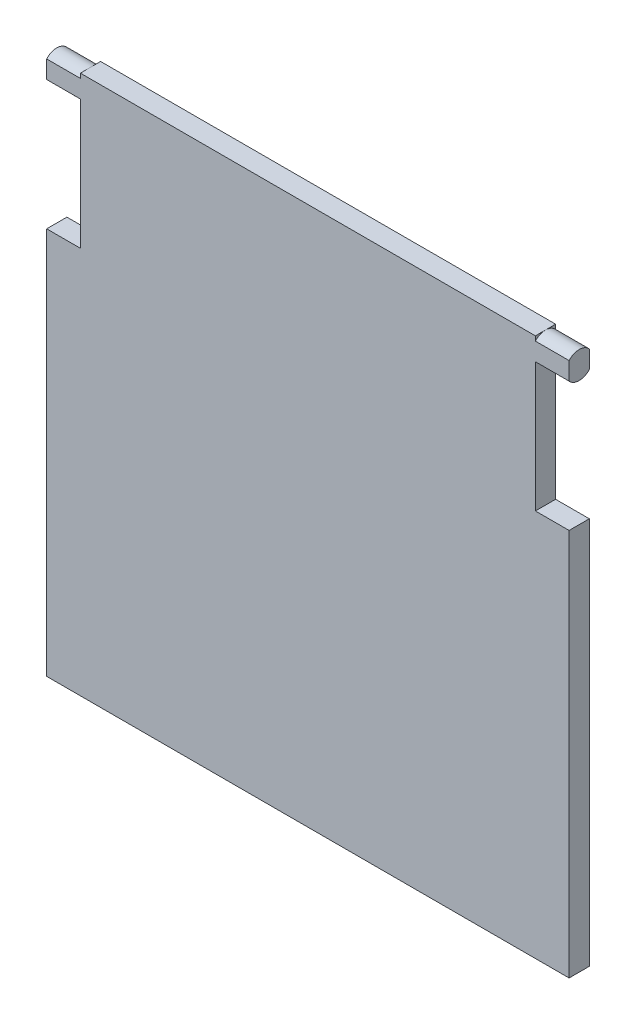
ISO-10303-21;
HEADER;
FILE_DESCRIPTION(('STEP AP214'),'2;1');
FILE_NAME('part.step','',(''),(''),'','','');
FILE_SCHEMA(('AUTOMOTIVE_DESIGN { 1 0 10303 214 1 1 1 1 }'));
ENDSEC;
DATA;
#1=APPLICATION_CONTEXT('core data for automotive mechanical design processes');
#2=APPLICATION_PROTOCOL_DEFINITION('international standard','automotive_design',2000,#1);
#3=PRODUCT_CONTEXT('',#1,'mechanical');
#4=PRODUCT('Part','Part','',(#3));
#5=PRODUCT_RELATED_PRODUCT_CATEGORY('part','',(#4));
#6=PRODUCT_DEFINITION_FORMATION('','',#4);
#7=PRODUCT_DEFINITION_CONTEXT('part definition',#1,'design');
#8=PRODUCT_DEFINITION('design','',#6,#7);
#9=PRODUCT_DEFINITION_SHAPE('','',#8);
#10=(LENGTH_UNIT() NAMED_UNIT(*) SI_UNIT(.MILLI.,.METRE.));
#11=(NAMED_UNIT(*) PLANE_ANGLE_UNIT() SI_UNIT($,.RADIAN.));
#12=(NAMED_UNIT(*) SI_UNIT($,.STERADIAN.) SOLID_ANGLE_UNIT());
#13=UNCERTAINTY_MEASURE_WITH_UNIT(LENGTH_MEASURE(1.E-05),#10,'distance_accuracy_value','');
#14=(GEOMETRIC_REPRESENTATION_CONTEXT(3) GLOBAL_UNCERTAINTY_ASSIGNED_CONTEXT((#13)) GLOBAL_UNIT_ASSIGNED_CONTEXT((#10,
#11,#12)) REPRESENTATION_CONTEXT('',''));
#15=CARTESIAN_POINT('',(0.,0.,0.));
#16=DIRECTION('',(0.,0.,1.));
#17=DIRECTION('',(1.,0.,0.));
#18=AXIS2_PLACEMENT_3D('',#15,#16,#17);
#19=CARTESIAN_POINT('',(1.99999999999999,2.,1.2));
#20=DIRECTION('',(1.,0.,0.));
#21=DIRECTION('',(0.,1.,0.));
#22=AXIS2_PLACEMENT_3D('',#19,#20,#21);
#23=PLANE('',#22);
#24=DIRECTION('',(0.,0.,-1.));
#25=VECTOR('',#24,1.);
#26=CARTESIAN_POINT('',(1.99999999999999,2.,1.2));
#27=LINE('',#26,#25);
#28=CARTESIAN_POINT('',(1.99999999999999,2.,1.2));
#29=VERTEX_POINT('',#28);
#30=CARTESIAN_POINT('',(1.99999999999999,2.,0.6));
#31=VERTEX_POINT('',#30);
#32=EDGE_CURVE('E311',#29,#31,#27,.T.);
#33=ORIENTED_EDGE('',*,*,#32,.T.);
#34=CARTESIAN_POINT('',(2.,1.2,0.6));
#35=DIRECTION('',(1.,0.,0.));
#36=DIRECTION('',(0.,1.,0.));
#37=AXIS2_PLACEMENT_3D('',#34,#35,#36);
#38=CIRCLE('',#37,0.800000000000001);
#39=CARTESIAN_POINT('',(1.99999999999999,1.72915026221292,1.2));
#40=VERTEX_POINT('',#39);
#41=EDGE_CURVE('E359',#31,#40,#38,.T.);
#42=ORIENTED_EDGE('',*,*,#41,.T.);
#43=DIRECTION('',(0.,-1.,0.));
#44=VECTOR('',#43,1.);
#45=CARTESIAN_POINT('',(1.99999999999999,2.,1.2));
#46=LINE('',#45,#44);
#47=EDGE_CURVE('E169',#29,#40,#46,.T.);
#48=ORIENTED_EDGE('',*,*,#47,.F.);
#49=EDGE_LOOP('',(#33,#42,#48));
#50=FACE_BOUND('',#49,.T.);
#51=ADVANCED_FACE('F40',(#50),#23,.F.);
#52=DIRECTION('',(0.,-1.,0.));
#53=VECTOR('',#52,1.);
#54=CARTESIAN_POINT('',(1.99999999999999,2.,0.));
#55=LINE('',#54,#53);
#56=CARTESIAN_POINT('',(1.99999999999999,2.,0.));
#57=VERTEX_POINT('',#56);
#58=CARTESIAN_POINT('',(1.99999999999999,1.72915026221292,0.));
#59=VERTEX_POINT('',#58);
#60=EDGE_CURVE('E284',#57,#59,#55,.T.);
#61=ORIENTED_EDGE('',*,*,#60,.T.);
#62=EDGE_CURVE('E56',#59,#31,#38,.T.);
#63=ORIENTED_EDGE('',*,*,#62,.T.);
#64=EDGE_CURVE('E310',#31,#57,#27,.T.);
#65=ORIENTED_EDGE('',*,*,#64,.T.);
#66=EDGE_LOOP('',(#61,#63,#65));
#67=FACE_BOUND('',#66,.T.);
#68=ADVANCED_FACE('F371',(#67),#23,.F.);
#69=CARTESIAN_POINT('',(29.,2.00000000000001,1.2));
#70=DIRECTION('',(-1.,0.,0.));
#71=DIRECTION('',(0.,-1.,0.));
#72=AXIS2_PLACEMENT_3D('',#69,#70,#71);
#73=PLANE('',#72);
#74=CARTESIAN_POINT('',(29.,1.2,0.6));
#75=DIRECTION('',(1.,0.,0.));
#76=DIRECTION('',(0.,1.,0.));
#77=AXIS2_PLACEMENT_3D('',#74,#75,#76);
#78=CIRCLE('',#77,0.800000000000001);
#79=CARTESIAN_POINT('',(29.,0.670849737787085,1.2));
#80=VERTEX_POINT('',#79);
#81=CARTESIAN_POINT('',(29.,0.670849737787085,0.));
#82=VERTEX_POINT('',#81);
#83=EDGE_CURVE('E174',#80,#82,#78,.T.);
#84=ORIENTED_EDGE('',*,*,#83,.F.);
#85=DIRECTION('',(0.,1.,0.));
#86=VECTOR('',#85,1.);
#87=CARTESIAN_POINT('',(29.,2.00000000000001,1.2));
#88=LINE('',#87,#86);
#89=CARTESIAN_POINT('',(29.,-6.99999999999999,1.2));
#90=VERTEX_POINT('',#89);
#91=EDGE_CURVE('E250',#90,#80,#88,.T.);
#92=ORIENTED_EDGE('',*,*,#91,.F.);
#93=DIRECTION('',(0.,0.,-1.));
#94=VECTOR('',#93,1.);
#95=CARTESIAN_POINT('',(29.,-6.99999999999999,1.2));
#96=LINE('',#95,#94);
#97=CARTESIAN_POINT('',(29.,-6.99999999999999,0.));
#98=VERTEX_POINT('',#97);
#99=EDGE_CURVE('E49',#90,#98,#96,.T.);
#100=ORIENTED_EDGE('',*,*,#99,.T.);
#101=DIRECTION('',(0.,1.,0.));
#102=VECTOR('',#101,1.);
#103=CARTESIAN_POINT('',(29.,2.00000000000001,0.));
#104=LINE('',#103,#102);
#105=EDGE_CURVE('E276',#98,#82,#104,.T.);
#106=ORIENTED_EDGE('',*,*,#105,.T.);
#107=EDGE_LOOP('',(#84,#92,#100,#106));
#108=FACE_BOUND('',#107,.T.);
#109=ADVANCED_FACE('F325',(#108),#73,.F.);
#110=CARTESIAN_POINT('',(29.,1.72915026221292,0.));
#111=VERTEX_POINT('',#110);
#112=CARTESIAN_POINT('',(29.,2.00000000000001,0.6));
#113=VERTEX_POINT('',#112);
#114=EDGE_CURVE('E214',#111,#113,#78,.T.);
#115=ORIENTED_EDGE('',*,*,#114,.F.);
#116=CARTESIAN_POINT('',(29.,2.00000000000001,0.));
#117=VERTEX_POINT('',#116);
#118=EDGE_CURVE('E275',#111,#117,#104,.T.);
#119=ORIENTED_EDGE('',*,*,#118,.T.);
#120=DIRECTION('',(0.,0.,-1.));
#121=VECTOR('',#120,1.);
#122=CARTESIAN_POINT('',(29.,2.00000000000001,1.2));
#123=LINE('',#122,#121);
#124=EDGE_CURVE('E315',#113,#117,#123,.T.);
#125=ORIENTED_EDGE('',*,*,#124,.F.);
#126=EDGE_LOOP('',(#115,#119,#125));
#127=FACE_BOUND('',#126,.T.);
#128=ADVANCED_FACE('F392',(#127),#73,.F.);
#129=CARTESIAN_POINT('',(31.,-6.99999999999999,1.2));
#130=DIRECTION('',(-1.,0.,0.));
#131=DIRECTION('',(0.,-1.,0.));
#132=AXIS2_PLACEMENT_3D('',#129,#130,#131);
#133=PLANE('',#132);
#134=DIRECTION('',(0.,1.,0.));
#135=VECTOR('',#134,1.);
#136=CARTESIAN_POINT('',(31.,-6.99999999999999,0.));
#137=LINE('',#136,#135);
#138=CARTESIAN_POINT('',(31.,-30.,0.));
#139=VERTEX_POINT('',#138);
#140=CARTESIAN_POINT('',(31.,-6.99999999999999,0.));
#141=VERTEX_POINT('',#140);
#142=EDGE_CURVE('E241',#139,#141,#137,.T.);
#143=ORIENTED_EDGE('',*,*,#142,.T.);
#144=DIRECTION('',(0.,0.,-1.));
#145=VECTOR('',#144,1.);
#146=CARTESIAN_POINT('',(31.,-6.99999999999999,1.2));
#147=LINE('',#146,#145);
#148=CARTESIAN_POINT('',(31.,-6.99999999999999,1.2));
#149=VERTEX_POINT('',#148);
#150=EDGE_CURVE('E12',#149,#141,#147,.T.);
#151=ORIENTED_EDGE('',*,*,#150,.F.);
#152=DIRECTION('',(0.,1.,0.));
#153=VECTOR('',#152,1.);
#154=CARTESIAN_POINT('',(31.,-6.99999999999999,1.2));
#155=LINE('',#154,#153);
#156=CARTESIAN_POINT('',(31.,-30.,1.2));
#157=VERTEX_POINT('',#156);
#158=EDGE_CURVE('E242',#157,#149,#155,.T.);
#159=ORIENTED_EDGE('',*,*,#158,.F.);
#160=DIRECTION('',(0.,0.,-1.));
#161=VECTOR('',#160,1.);
#162=CARTESIAN_POINT('',(31.,-30.,1.2));
#163=LINE('',#162,#161);
#164=EDGE_CURVE('E268',#157,#139,#163,.T.);
#165=ORIENTED_EDGE('',*,*,#164,.T.);
#166=EDGE_LOOP('',(#143,#151,#159,#165));
#167=FACE_BOUND('',#166,.T.);
#168=ADVANCED_FACE('F42',(#167),#133,.F.);
#169=CARTESIAN_POINT('',(31.,-6.99999999999999,1.2));
#170=DIRECTION('',(0.,-1.,0.));
#171=DIRECTION('',(1.,0.,0.));
#172=AXIS2_PLACEMENT_3D('',#169,#170,#171);
#173=PLANE('',#172);
#174=DIRECTION('',(-1.,0.,0.));
#175=VECTOR('',#174,1.);
#176=CARTESIAN_POINT('',(31.,-6.99999999999999,0.));
#177=LINE('',#176,#175);
#178=EDGE_CURVE('E272',#141,#98,#177,.T.);
#179=ORIENTED_EDGE('',*,*,#178,.T.);
#180=ORIENTED_EDGE('',*,*,#99,.F.);
#181=DIRECTION('',(-1.,0.,0.));
#182=VECTOR('',#181,1.);
#183=CARTESIAN_POINT('',(31.,-6.99999999999999,1.2));
#184=LINE('',#183,#182);
#185=EDGE_CURVE('E245',#149,#90,#184,.T.);
#186=ORIENTED_EDGE('',*,*,#185,.F.);
#187=ORIENTED_EDGE('',*,*,#150,.T.);
#188=EDGE_LOOP('',(#179,#180,#186,#187));
#189=FACE_BOUND('',#188,.T.);
#190=ADVANCED_FACE('F339',(#189),#173,.F.);
#191=CARTESIAN_POINT('',(29.,1.72915026221292,1.2));
#192=VERTEX_POINT('',#191);
#193=EDGE_CURVE('E224',#113,#192,#78,.T.);
#194=ORIENTED_EDGE('',*,*,#193,.F.);
#195=CARTESIAN_POINT('',(29.,2.00000000000001,1.2));
#196=VERTEX_POINT('',#195);
#197=EDGE_CURVE('E316',#196,#113,#123,.T.);
#198=ORIENTED_EDGE('',*,*,#197,.F.);
#199=EDGE_CURVE('E249',#192,#196,#88,.T.);
#200=ORIENTED_EDGE('',*,*,#199,.F.);
#201=EDGE_LOOP('',(#194,#198,#200));
#202=FACE_BOUND('',#201,.T.);
#203=ADVANCED_FACE('F385',(#202),#73,.F.);
#204=CARTESIAN_POINT('',(1.99999999999999,2.,1.2));
#205=DIRECTION('',(0.,-1.,0.));
#206=DIRECTION('',(1.,0.,0.));
#207=AXIS2_PLACEMENT_3D('',#204,#205,#206);
#208=PLANE('',#207);
#209=DIRECTION('',(-1.,0.,0.));
#210=VECTOR('',#209,1.);
#211=CARTESIAN_POINT('',(1.99999999999999,2.,0.));
#212=LINE('',#211,#210);
#213=EDGE_CURVE('E279',#117,#57,#212,.T.);
#214=ORIENTED_EDGE('',*,*,#213,.T.);
#215=ORIENTED_EDGE('',*,*,#64,.F.);
#216=ORIENTED_EDGE('',*,*,#32,.F.);
#217=DIRECTION('',(-1.,0.,0.));
#218=VECTOR('',#217,1.);
#219=CARTESIAN_POINT('',(1.99999999999999,2.,1.2));
#220=LINE('',#219,#218);
#221=EDGE_CURVE('E254',#196,#29,#220,.T.);
#222=ORIENTED_EDGE('',*,*,#221,.F.);
#223=ORIENTED_EDGE('',*,*,#197,.T.);
#224=ORIENTED_EDGE('',*,*,#124,.T.);
#225=EDGE_LOOP('',(#214,#215,#216,#222,#223,#224));
#226=FACE_BOUND('',#225,.T.);
#227=ADVANCED_FACE('F380',(#226),#208,.F.);
#228=CARTESIAN_POINT('',(1.99999999999999,0.670849737787082,1.2));
#229=VERTEX_POINT('',#228);
#230=CARTESIAN_POINT('',(2.,-7.,1.2));
#231=VERTEX_POINT('',#230);
#232=EDGE_CURVE('E64',#229,#231,#46,.T.);
#233=ORIENTED_EDGE('',*,*,#232,.F.);
#234=CARTESIAN_POINT('',(2.,0.670849737787081,0.));
#235=VERTEX_POINT('',#234);
#236=EDGE_CURVE('E186',#229,#235,#38,.T.);
#237=ORIENTED_EDGE('',*,*,#236,.T.);
#238=CARTESIAN_POINT('',(2.,-7.,0.));
#239=VERTEX_POINT('',#238);
#240=EDGE_CURVE('E283',#235,#239,#55,.T.);
#241=ORIENTED_EDGE('',*,*,#240,.T.);
#242=DIRECTION('',(0.,0.,-1.));
#243=VECTOR('',#242,1.);
#244=CARTESIAN_POINT('',(2.,-7.,1.2));
#245=LINE('',#244,#243);
#246=EDGE_CURVE('E306',#231,#239,#245,.T.);
#247=ORIENTED_EDGE('',*,*,#246,.F.);
#248=EDGE_LOOP('',(#233,#237,#241,#247));
#249=FACE_BOUND('',#248,.T.);
#250=ADVANCED_FACE('F357',(#249),#23,.F.);
#251=CARTESIAN_POINT('',(0.,-7.,1.2));
#252=DIRECTION('',(0.,-1.,0.));
#253=DIRECTION('',(0.,0.,-1.));
#254=AXIS2_PLACEMENT_3D('',#251,#252,#253);
#255=PLANE('',#254);
#256=DIRECTION('',(-1.,0.,0.));
#257=VECTOR('',#256,1.);
#258=CARTESIAN_POINT('',(0.,-7.,0.));
#259=LINE('',#258,#257);
#260=CARTESIAN_POINT('',(0.,-7.,0.));
#261=VERTEX_POINT('',#260);
#262=EDGE_CURVE('E287',#239,#261,#259,.T.);
#263=ORIENTED_EDGE('',*,*,#262,.T.);
#264=DIRECTION('',(0.,0.,-1.));
#265=VECTOR('',#264,1.);
#266=CARTESIAN_POINT('',(0.,-7.,1.2));
#267=LINE('',#266,#265);
#268=CARTESIAN_POINT('',(0.,-7.,1.2));
#269=VERTEX_POINT('',#268);
#270=EDGE_CURVE('E302',#269,#261,#267,.T.);
#271=ORIENTED_EDGE('',*,*,#270,.F.);
#272=DIRECTION('',(-1.,0.,0.));
#273=VECTOR('',#272,1.);
#274=CARTESIAN_POINT('',(0.,-7.,1.2));
#275=LINE('',#274,#273);
#276=EDGE_CURVE('E259',#231,#269,#275,.T.);
#277=ORIENTED_EDGE('',*,*,#276,.F.);
#278=ORIENTED_EDGE('',*,*,#246,.T.);
#279=EDGE_LOOP('',(#263,#271,#277,#278));
#280=FACE_BOUND('',#279,.T.);
#281=ADVANCED_FACE('F355',(#280),#255,.F.);
#282=CARTESIAN_POINT('',(0.,-7.,1.2));
#283=DIRECTION('',(1.,0.,0.));
#284=DIRECTION('',(0.,1.,0.));
#285=AXIS2_PLACEMENT_3D('',#282,#283,#284);
#286=PLANE('',#285);
#287=DIRECTION('',(0.,-1.,0.));
#288=VECTOR('',#287,1.);
#289=CARTESIAN_POINT('',(0.,-7.,0.));
#290=LINE('',#289,#288);
#291=CARTESIAN_POINT('',(0.,-30.,0.));
#292=VERTEX_POINT('',#291);
#293=EDGE_CURVE('E290',#261,#292,#290,.T.);
#294=ORIENTED_EDGE('',*,*,#293,.T.);
#295=DIRECTION('',(0.,0.,-1.));
#296=VECTOR('',#295,1.);
#297=CARTESIAN_POINT('',(0.,-30.,1.2));
#298=LINE('',#297,#296);
#299=CARTESIAN_POINT('',(0.,-30.,1.2));
#300=VERTEX_POINT('',#299);
#301=EDGE_CURVE('E298',#300,#292,#298,.T.);
#302=ORIENTED_EDGE('',*,*,#301,.F.);
#303=DIRECTION('',(0.,-1.,0.));
#304=VECTOR('',#303,1.);
#305=CARTESIAN_POINT('',(0.,-7.,1.2));
#306=LINE('',#305,#304);
#307=EDGE_CURVE('E262',#269,#300,#306,.T.);
#308=ORIENTED_EDGE('',*,*,#307,.F.);
#309=ORIENTED_EDGE('',*,*,#270,.T.);
#310=EDGE_LOOP('',(#294,#302,#308,#309));
#311=FACE_BOUND('',#310,.T.);
#312=ADVANCED_FACE('F351',(#311),#286,.F.);
#313=CARTESIAN_POINT('',(0.,-30.,1.2));
#314=DIRECTION('',(0.,1.,0.));
#315=DIRECTION('',(-1.,0.,0.));
#316=AXIS2_PLACEMENT_3D('',#313,#314,#315);
#317=PLANE('',#316);
#318=DIRECTION('',(1.,0.,0.));
#319=VECTOR('',#318,1.);
#320=CARTESIAN_POINT('',(0.,-30.,0.));
#321=LINE('',#320,#319);
#322=EDGE_CURVE('E246',#292,#139,#321,.T.);
#323=ORIENTED_EDGE('',*,*,#322,.T.);
#324=ORIENTED_EDGE('',*,*,#164,.F.);
#325=DIRECTION('',(1.,0.,0.));
#326=VECTOR('',#325,1.);
#327=CARTESIAN_POINT('',(0.,-30.,1.2));
#328=LINE('',#327,#326);
#329=EDGE_CURVE('E265',#300,#157,#328,.T.);
#330=ORIENTED_EDGE('',*,*,#329,.F.);
#331=ORIENTED_EDGE('',*,*,#301,.T.);
#332=EDGE_LOOP('',(#323,#324,#330,#331));
#333=FACE_BOUND('',#332,.T.);
#334=ADVANCED_FACE('F346',(#333),#317,.F.);
#335=CARTESIAN_POINT('',(0.,0.,1.2));
#336=DIRECTION('',(0.,0.,1.));
#337=DIRECTION('',(1.,0.,0.));
#338=AXIS2_PLACEMENT_3D('',#335,#336,#337);
#339=PLANE('',#338);
#340=ORIENTED_EDGE('',*,*,#158,.T.);
#341=ORIENTED_EDGE('',*,*,#185,.T.);
#342=ORIENTED_EDGE('',*,*,#91,.T.);
#343=DIRECTION('',(-1.,0.,0.));
#344=VECTOR('',#343,1.);
#345=CARTESIAN_POINT('',(31.,0.670849737787088,1.2));
#346=LINE('',#345,#344);
#347=CARTESIAN_POINT('',(31.,0.670849737787088,1.2));
#348=VERTEX_POINT('',#347);
#349=EDGE_CURVE('E237',#348,#80,#346,.T.);
#350=ORIENTED_EDGE('',*,*,#349,.F.);
#351=DIRECTION('',(0.,-1.,0.));
#352=VECTOR('',#351,1.);
#353=CARTESIAN_POINT('',(31.,0.,1.2));
#354=LINE('',#353,#352);
#355=CARTESIAN_POINT('',(31.,1.72915026221293,1.2));
#356=VERTEX_POINT('',#355);
#357=EDGE_CURVE('E209',#356,#348,#354,.T.);
#358=ORIENTED_EDGE('',*,*,#357,.F.);
#359=DIRECTION('',(-1.,0.,0.));
#360=VECTOR('',#359,1.);
#361=CARTESIAN_POINT('',(31.,1.72915026221293,1.2));
#362=LINE('',#361,#360);
#363=EDGE_CURVE('E225',#356,#192,#362,.T.);
#364=ORIENTED_EDGE('',*,*,#363,.T.);
#365=ORIENTED_EDGE('',*,*,#199,.T.);
#366=ORIENTED_EDGE('',*,*,#221,.T.);
#367=ORIENTED_EDGE('',*,*,#47,.T.);
#368=DIRECTION('',(1.,0.,0.));
#369=VECTOR('',#368,1.);
#370=CARTESIAN_POINT('',(0.,1.72915026221292,1.2));
#371=LINE('',#370,#369);
#372=CARTESIAN_POINT('',(0.,1.72915026221292,1.2));
#373=VERTEX_POINT('',#372);
#374=EDGE_CURVE('E162',#373,#40,#371,.T.);
#375=ORIENTED_EDGE('',*,*,#374,.F.);
#376=DIRECTION('',(0.,-1.,0.));
#377=VECTOR('',#376,1.);
#378=CARTESIAN_POINT('',(0.,0.,1.2));
#379=LINE('',#378,#377);
#380=CARTESIAN_POINT('',(0.,0.670849737787085,1.2));
#381=VERTEX_POINT('',#380);
#382=EDGE_CURVE('E166',#373,#381,#379,.T.);
#383=ORIENTED_EDGE('',*,*,#382,.T.);
#384=DIRECTION('',(1.,0.,0.));
#385=VECTOR('',#384,1.);
#386=CARTESIAN_POINT('',(0.,0.670849737787085,1.2));
#387=LINE('',#386,#385);
#388=EDGE_CURVE('E196',#381,#229,#387,.T.);
#389=ORIENTED_EDGE('',*,*,#388,.T.);
#390=ORIENTED_EDGE('',*,*,#232,.T.);
#391=ORIENTED_EDGE('',*,*,#276,.T.);
#392=ORIENTED_EDGE('',*,*,#307,.T.);
#393=ORIENTED_EDGE('',*,*,#329,.T.);
#394=EDGE_LOOP('',(#340,#341,#342,#350,#358,#364,#365,#366,#367,#375,#383,#389,#390,#391,#392,#393));
#395=FACE_BOUND('',#394,.T.);
#396=ADVANCED_FACE('F165',(#395),#339,.T.);
#397=CARTESIAN_POINT('',(0.,0.,0.));
#398=DIRECTION('',(0.,0.,1.));
#399=DIRECTION('',(1.,0.,0.));
#400=AXIS2_PLACEMENT_3D('',#397,#398,#399);
#401=PLANE('',#400);
#402=ORIENTED_EDGE('',*,*,#142,.F.);
#403=ORIENTED_EDGE('',*,*,#322,.F.);
#404=ORIENTED_EDGE('',*,*,#293,.F.);
#405=ORIENTED_EDGE('',*,*,#262,.F.);
#406=ORIENTED_EDGE('',*,*,#240,.F.);
#407=DIRECTION('',(1.,0.,0.));
#408=VECTOR('',#407,1.);
#409=CARTESIAN_POINT('',(0.,0.670849737787084,0.));
#410=LINE('',#409,#408);
#411=CARTESIAN_POINT('',(0.,0.670849737787084,0.));
#412=VERTEX_POINT('',#411);
#413=EDGE_CURVE('E200',#412,#235,#410,.T.);
#414=ORIENTED_EDGE('',*,*,#413,.F.);
#415=DIRECTION('',(0.,1.,0.));
#416=VECTOR('',#415,1.);
#417=CARTESIAN_POINT('',(0.,0.,0.));
#418=LINE('',#417,#416);
#419=CARTESIAN_POINT('',(0.,1.72915026221292,0.));
#420=VERTEX_POINT('',#419);
#421=EDGE_CURVE('E191',#412,#420,#418,.T.);
#422=ORIENTED_EDGE('',*,*,#421,.T.);
#423=DIRECTION('',(1.,0.,0.));
#424=VECTOR('',#423,1.);
#425=CARTESIAN_POINT('',(0.,1.72915026221292,0.));
#426=LINE('',#425,#424);
#427=EDGE_CURVE('E175',#420,#59,#426,.T.);
#428=ORIENTED_EDGE('',*,*,#427,.T.);
#429=ORIENTED_EDGE('',*,*,#60,.F.);
#430=ORIENTED_EDGE('',*,*,#213,.F.);
#431=ORIENTED_EDGE('',*,*,#118,.F.);
#432=DIRECTION('',(-1.,0.,0.));
#433=VECTOR('',#432,1.);
#434=CARTESIAN_POINT('',(31.,1.72915026221293,0.));
#435=LINE('',#434,#433);
#436=CARTESIAN_POINT('',(31.,1.72915026221293,0.));
#437=VERTEX_POINT('',#436);
#438=EDGE_CURVE('E229',#437,#111,#435,.T.);
#439=ORIENTED_EDGE('',*,*,#438,.F.);
#440=DIRECTION('',(0.,1.,0.));
#441=VECTOR('',#440,1.);
#442=CARTESIAN_POINT('',(31.,0.,0.));
#443=LINE('',#442,#441);
#444=CARTESIAN_POINT('',(31.,0.670849737787088,0.));
#445=VERTEX_POINT('',#444);
#446=EDGE_CURVE('E217',#445,#437,#443,.T.);
#447=ORIENTED_EDGE('',*,*,#446,.F.);
#448=DIRECTION('',(-1.,0.,0.));
#449=VECTOR('',#448,1.);
#450=CARTESIAN_POINT('',(31.,0.670849737787088,0.));
#451=LINE('',#450,#449);
#452=EDGE_CURVE('E233',#445,#82,#451,.T.);
#453=ORIENTED_EDGE('',*,*,#452,.T.);
#454=ORIENTED_EDGE('',*,*,#105,.F.);
#455=ORIENTED_EDGE('',*,*,#178,.F.);
#456=EDGE_LOOP('',(#402,#403,#404,#405,#406,#414,#422,#428,#429,#430,#431,#439,#447,#453,#454,#455));
#457=FACE_BOUND('',#456,.T.);
#458=ADVANCED_FACE('F329',(#457),#401,.F.);
#459=CARTESIAN_POINT('',(31.,1.20000000000001,0.6));
#460=DIRECTION('',(-1.,0.,0.));
#461=DIRECTION('',(0.,-1.,0.));
#462=AXIS2_PLACEMENT_3D('',#459,#460,#461);
#463=CYLINDRICAL_SURFACE('',#462,0.800000000000001);
#464=ORIENTED_EDGE('',*,*,#83,.T.);
#465=ORIENTED_EDGE('',*,*,#452,.F.);
#466=CARTESIAN_POINT('',(31.,1.20000000000001,0.6));
#467=DIRECTION('',(1.,0.,0.));
#468=DIRECTION('',(0.,1.,0.));
#469=AXIS2_PLACEMENT_3D('',#466,#467,#468);
#470=CIRCLE('',#469,0.800000000000001);
#471=EDGE_CURVE('E213',#348,#445,#470,.T.);
#472=ORIENTED_EDGE('',*,*,#471,.F.);
#473=ORIENTED_EDGE('',*,*,#349,.T.);
#474=EDGE_LOOP('',(#464,#465,#472,#473));
#475=FACE_BOUND('',#474,.T.);
#476=ADVANCED_FACE('F334',(#475),#463,.T.);
#477=ORIENTED_EDGE('',*,*,#114,.T.);
#478=ORIENTED_EDGE('',*,*,#193,.T.);
#479=ORIENTED_EDGE('',*,*,#363,.F.);
#480=EDGE_CURVE('E218',#437,#356,#470,.T.);
#481=ORIENTED_EDGE('',*,*,#480,.F.);
#482=ORIENTED_EDGE('',*,*,#438,.T.);
#483=EDGE_LOOP('',(#477,#478,#479,#481,#482));
#484=FACE_BOUND('',#483,.T.);
#485=ADVANCED_FACE('F413',(#484),#463,.T.);
#486=CARTESIAN_POINT('',(31.,0.,0.));
#487=DIRECTION('',(1.,0.,0.));
#488=DIRECTION('',(0.,1.,0.));
#489=AXIS2_PLACEMENT_3D('',#486,#487,#488);
#490=PLANE('',#489);
#491=ORIENTED_EDGE('',*,*,#357,.T.);
#492=ORIENTED_EDGE('',*,*,#471,.T.);
#493=ORIENTED_EDGE('',*,*,#446,.T.);
#494=ORIENTED_EDGE('',*,*,#480,.T.);
#495=EDGE_LOOP('',(#491,#492,#493,#494));
#496=FACE_BOUND('',#495,.T.);
#497=ADVANCED_FACE('F368',(#496),#490,.T.);
#498=CARTESIAN_POINT('',(0.,1.2,0.6));
#499=DIRECTION('',(1.,0.,0.));
#500=DIRECTION('',(0.,1.,0.));
#501=AXIS2_PLACEMENT_3D('',#498,#499,#500);
#502=CYLINDRICAL_SURFACE('',#501,0.800000000000001);
#503=ORIENTED_EDGE('',*,*,#62,.F.);
#504=ORIENTED_EDGE('',*,*,#427,.F.);
#505=CARTESIAN_POINT('',(0.,1.2,0.6));
#506=DIRECTION('',(1.,0.,0.));
#507=DIRECTION('',(0.,1.,0.));
#508=AXIS2_PLACEMENT_3D('',#505,#506,#507);
#509=CIRCLE('',#508,0.800000000000001);
#510=EDGE_CURVE('E181',#420,#373,#509,.T.);
#511=ORIENTED_EDGE('',*,*,#510,.T.);
#512=ORIENTED_EDGE('',*,*,#374,.T.);
#513=ORIENTED_EDGE('',*,*,#41,.F.);
#514=EDGE_LOOP('',(#503,#504,#511,#512,#513));
#515=FACE_BOUND('',#514,.T.);
#516=ADVANCED_FACE('F188',(#515),#502,.T.);
#517=ORIENTED_EDGE('',*,*,#236,.F.);
#518=ORIENTED_EDGE('',*,*,#388,.F.);
#519=EDGE_CURVE('E184',#381,#412,#509,.T.);
#520=ORIENTED_EDGE('',*,*,#519,.T.);
#521=ORIENTED_EDGE('',*,*,#413,.T.);
#522=EDGE_LOOP('',(#517,#518,#520,#521));
#523=FACE_BOUND('',#522,.T.);
#524=ADVANCED_FACE('F360',(#523),#502,.T.);
#525=CARTESIAN_POINT('',(0.,0.,0.));
#526=DIRECTION('',(-1.,0.,0.));
#527=DIRECTION('',(0.,1.,0.));
#528=AXIS2_PLACEMENT_3D('',#525,#526,#527);
#529=PLANE('',#528);
#530=ORIENTED_EDGE('',*,*,#382,.F.);
#531=ORIENTED_EDGE('',*,*,#510,.F.);
#532=ORIENTED_EDGE('',*,*,#421,.F.);
#533=ORIENTED_EDGE('',*,*,#519,.F.);
#534=EDGE_LOOP('',(#530,#531,#532,#533));
#535=FACE_BOUND('',#534,.T.);
#536=ADVANCED_FACE('F179',(#535),#529,.T.);
#537=CLOSED_SHELL('',(#51,#68,#109,#128,#168,#190,#203,#227,#250,#281,#312,#334,#396,#458,#476,
#485,#497,#516,#524,#536));
#538=MANIFOLD_SOLID_BREP('B2',#537);
#539=ADVANCED_BREP_SHAPE_REPRESENTATION('',(#18,#538),#14);
#540=SHAPE_DEFINITION_REPRESENTATION(#9,#539);
ENDSEC;
END-ISO-10303-21;
